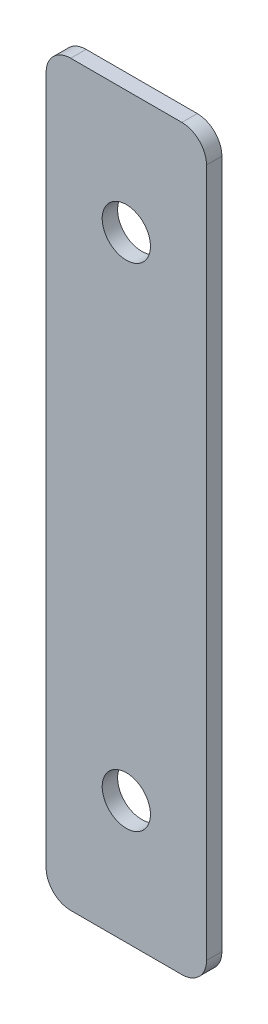
ISO-10303-21;
HEADER;
FILE_DESCRIPTION(('STEP AP214'),'2;1');
FILE_NAME('part.step','',(''),(''),'','','');
FILE_SCHEMA(('AUTOMOTIVE_DESIGN { 1 0 10303 214 1 1 1 1 }'));
ENDSEC;
DATA;
#1=APPLICATION_CONTEXT('core data for automotive mechanical design processes');
#2=APPLICATION_PROTOCOL_DEFINITION('international standard','automotive_design',2000,#1);
#3=PRODUCT_CONTEXT('',#1,'mechanical');
#4=PRODUCT('Part','Part','',(#3));
#5=PRODUCT_RELATED_PRODUCT_CATEGORY('part','',(#4));
#6=PRODUCT_DEFINITION_FORMATION('','',#4);
#7=PRODUCT_DEFINITION_CONTEXT('part definition',#1,'design');
#8=PRODUCT_DEFINITION('design','',#6,#7);
#9=PRODUCT_DEFINITION_SHAPE('','',#8);
#10=(LENGTH_UNIT() NAMED_UNIT(*) SI_UNIT(.MILLI.,.METRE.));
#11=(NAMED_UNIT(*) PLANE_ANGLE_UNIT() SI_UNIT($,.RADIAN.));
#12=(NAMED_UNIT(*) SI_UNIT($,.STERADIAN.) SOLID_ANGLE_UNIT());
#13=UNCERTAINTY_MEASURE_WITH_UNIT(LENGTH_MEASURE(1.E-05),#10,'distance_accuracy_value','');
#14=(GEOMETRIC_REPRESENTATION_CONTEXT(3) GLOBAL_UNCERTAINTY_ASSIGNED_CONTEXT((#13)) GLOBAL_UNIT_ASSIGNED_CONTEXT((#10,
#11,#12)) REPRESENTATION_CONTEXT('',''));
#15=CARTESIAN_POINT('',(0.,0.,0.));
#16=DIRECTION('',(0.,0.,1.));
#17=DIRECTION('',(1.,0.,0.));
#18=AXIS2_PLACEMENT_3D('',#15,#16,#17);
#19=CARTESIAN_POINT('',(-5.74039999999996,-53.975,1.5875));
#20=DIRECTION('',(0.,0.,1.));
#21=DIRECTION('',(1.,0.,0.));
#22=AXIS2_PLACEMENT_3D('',#19,#20,#21);
#23=PLANE('',#22);
#24=CARTESIAN_POINT('',(0.,-43.815,1.5875));
#25=DIRECTION('',(0.,0.,1.));
#26=DIRECTION('',(1.,0.,0.));
#27=AXIS2_PLACEMENT_3D('',#24,#25,#26);
#28=CIRCLE('',#27,2.4892);
#29=CARTESIAN_POINT('',(2.48920000000004,-43.815,1.5875));
#30=VERTEX_POINT('',#29);
#31=EDGE_CURVE('E140',#30,#30,#28,.T.);
#32=ORIENTED_EDGE('',*,*,#31,.F.);
#33=EDGE_LOOP('',(#32));
#34=FACE_BOUND('',#33,.T.);
#35=CARTESIAN_POINT('',(-5.74039999999996,-53.975,1.5875));
#36=DIRECTION('',(0.,0.,1.));
#37=DIRECTION('',(1.,0.,0.));
#38=AXIS2_PLACEMENT_3D('',#35,#36,#37);
#39=CIRCLE('',#38,2.54);
#40=CARTESIAN_POINT('',(-8.28039999999996,-53.975,1.5875));
#41=VERTEX_POINT('',#40);
#42=CARTESIAN_POINT('',(-5.74039999999996,-56.515,1.5875));
#43=VERTEX_POINT('',#42);
#44=EDGE_CURVE('E151',#41,#43,#39,.T.);
#45=ORIENTED_EDGE('',*,*,#44,.T.);
#46=DIRECTION('',(1.,0.,0.));
#47=VECTOR('',#46,1.);
#48=CARTESIAN_POINT('',(5.74039999999996,-56.515,1.5875));
#49=LINE('',#48,#47);
#50=CARTESIAN_POINT('',(5.74039999999997,-56.515,1.5875));
#51=VERTEX_POINT('',#50);
#52=EDGE_CURVE('E99',#43,#51,#49,.T.);
#53=ORIENTED_EDGE('',*,*,#52,.T.);
#54=CARTESIAN_POINT('',(5.74039999999996,-53.975,1.5875));
#55=DIRECTION('',(0.,0.,1.));
#56=DIRECTION('',(-1.,0.,0.));
#57=AXIS2_PLACEMENT_3D('',#54,#55,#56);
#58=CIRCLE('',#57,2.54);
#59=CARTESIAN_POINT('',(8.28039999999996,-53.975,1.5875));
#60=VERTEX_POINT('',#59);
#61=EDGE_CURVE('E166',#51,#60,#58,.T.);
#62=ORIENTED_EDGE('',*,*,#61,.T.);
#63=DIRECTION('',(0.,1.,0.));
#64=VECTOR('',#63,1.);
#65=CARTESIAN_POINT('',(8.28039999999996,-53.975,1.5875));
#66=LINE('',#65,#64);
#67=CARTESIAN_POINT('',(8.28039999999997,17.145,1.5875));
#68=VERTEX_POINT('',#67);
#69=EDGE_CURVE('E179',#60,#68,#66,.T.);
#70=ORIENTED_EDGE('',*,*,#69,.T.);
#71=CARTESIAN_POINT('',(5.74039999999996,17.145,1.5875));
#72=DIRECTION('',(0.,0.,1.));
#73=DIRECTION('',(-1.,0.,0.));
#74=AXIS2_PLACEMENT_3D('',#71,#72,#73);
#75=CIRCLE('',#74,2.54);
#76=CARTESIAN_POINT('',(5.74039999999996,19.685,1.5875));
#77=VERTEX_POINT('',#76);
#78=EDGE_CURVE('E118',#68,#77,#75,.T.);
#79=ORIENTED_EDGE('',*,*,#78,.T.);
#80=DIRECTION('',(-1.,0.,0.));
#81=VECTOR('',#80,1.);
#82=CARTESIAN_POINT('',(5.74039999999996,19.685,1.5875));
#83=LINE('',#82,#81);
#84=CARTESIAN_POINT('',(-5.74039999999996,19.685,1.5875));
#85=VERTEX_POINT('',#84);
#86=EDGE_CURVE('E112',#77,#85,#83,.T.);
#87=ORIENTED_EDGE('',*,*,#86,.T.);
#88=CARTESIAN_POINT('',(-5.74039999999996,17.145,1.5875));
#89=DIRECTION('',(0.,0.,1.));
#90=DIRECTION('',(1.,0.,0.));
#91=AXIS2_PLACEMENT_3D('',#88,#89,#90);
#92=CIRCLE('',#91,2.54);
#93=CARTESIAN_POINT('',(-8.28039999999996,17.145,1.5875));
#94=VERTEX_POINT('',#93);
#95=EDGE_CURVE('E116',#85,#94,#92,.T.);
#96=ORIENTED_EDGE('',*,*,#95,.T.);
#97=DIRECTION('',(0.,-1.,0.));
#98=VECTOR('',#97,1.);
#99=CARTESIAN_POINT('',(-8.28039999999996,-53.975,1.5875));
#100=LINE('',#99,#98);
#101=EDGE_CURVE('E56',#94,#41,#100,.T.);
#102=ORIENTED_EDGE('',*,*,#101,.T.);
#103=EDGE_LOOP('',(#45,#53,#62,#70,#79,#87,#96,#102));
#104=FACE_BOUND('',#103,.T.);
#105=CARTESIAN_POINT('',(0.,6.98499999999995,1.5875));
#106=DIRECTION('',(0.,0.,1.));
#107=DIRECTION('',(1.,0.,0.));
#108=AXIS2_PLACEMENT_3D('',#105,#106,#107);
#109=CIRCLE('',#108,2.4892);
#110=CARTESIAN_POINT('',(2.48920000000003,6.98499999999995,1.5875));
#111=VERTEX_POINT('',#110);
#112=EDGE_CURVE('E188',#111,#111,#109,.T.);
#113=ORIENTED_EDGE('',*,*,#112,.F.);
#114=EDGE_LOOP('',(#113));
#115=FACE_BOUND('',#114,.T.);
#116=ADVANCED_FACE('F39',(#34,#104,#115),#23,.T.);
#117=CARTESIAN_POINT('',(-5.74039999999996,-53.975,0.));
#118=DIRECTION('',(0.,0.,1.));
#119=DIRECTION('',(1.,0.,0.));
#120=AXIS2_PLACEMENT_3D('',#117,#118,#119);
#121=PLANE('',#120);
#122=CARTESIAN_POINT('',(-5.74039999999996,-53.975,0.));
#123=DIRECTION('',(0.,0.,1.));
#124=DIRECTION('',(1.,0.,0.));
#125=AXIS2_PLACEMENT_3D('',#122,#123,#124);
#126=CIRCLE('',#125,2.54);
#127=CARTESIAN_POINT('',(-8.28039999999996,-53.975,0.));
#128=VERTEX_POINT('',#127);
#129=CARTESIAN_POINT('',(-5.74039999999996,-56.515,0.));
#130=VERTEX_POINT('',#129);
#131=EDGE_CURVE('E136',#128,#130,#126,.T.);
#132=ORIENTED_EDGE('',*,*,#131,.F.);
#133=DIRECTION('',(0.,-1.,0.));
#134=VECTOR('',#133,1.);
#135=CARTESIAN_POINT('',(-8.28039999999996,-53.975,0.));
#136=LINE('',#135,#134);
#137=CARTESIAN_POINT('',(-8.28039999999996,17.145,0.));
#138=VERTEX_POINT('',#137);
#139=EDGE_CURVE('E91',#138,#128,#136,.T.);
#140=ORIENTED_EDGE('',*,*,#139,.F.);
#141=CARTESIAN_POINT('',(-5.74039999999996,17.145,0.));
#142=DIRECTION('',(0.,0.,1.));
#143=DIRECTION('',(1.,0.,0.));
#144=AXIS2_PLACEMENT_3D('',#141,#142,#143);
#145=CIRCLE('',#144,2.54);
#146=CARTESIAN_POINT('',(-5.74039999999996,19.685,0.));
#147=VERTEX_POINT('',#146);
#148=EDGE_CURVE('E85',#147,#138,#145,.T.);
#149=ORIENTED_EDGE('',*,*,#148,.F.);
#150=DIRECTION('',(-1.,0.,0.));
#151=VECTOR('',#150,1.);
#152=CARTESIAN_POINT('',(5.74039999999996,19.685,0.));
#153=LINE('',#152,#151);
#154=CARTESIAN_POINT('',(5.74039999999996,19.685,0.));
#155=VERTEX_POINT('',#154);
#156=EDGE_CURVE('E126',#155,#147,#153,.T.);
#157=ORIENTED_EDGE('',*,*,#156,.F.);
#158=CARTESIAN_POINT('',(5.74039999999996,17.145,0.));
#159=DIRECTION('',(0.,0.,1.));
#160=DIRECTION('',(-1.,0.,0.));
#161=AXIS2_PLACEMENT_3D('',#158,#159,#160);
#162=CIRCLE('',#161,2.54);
#163=CARTESIAN_POINT('',(8.28039999999997,17.145,0.));
#164=VERTEX_POINT('',#163);
#165=EDGE_CURVE('E146',#164,#155,#162,.T.);
#166=ORIENTED_EDGE('',*,*,#165,.F.);
#167=DIRECTION('',(0.,1.,0.));
#168=VECTOR('',#167,1.);
#169=CARTESIAN_POINT('',(8.28039999999996,-53.975,0.));
#170=LINE('',#169,#168);
#171=CARTESIAN_POINT('',(8.28039999999996,-53.975,0.));
#172=VERTEX_POINT('',#171);
#173=EDGE_CURVE('E144',#172,#164,#170,.T.);
#174=ORIENTED_EDGE('',*,*,#173,.F.);
#175=CARTESIAN_POINT('',(5.74039999999996,-53.975,0.));
#176=DIRECTION('',(0.,0.,1.));
#177=DIRECTION('',(-1.,0.,0.));
#178=AXIS2_PLACEMENT_3D('',#175,#176,#177);
#179=CIRCLE('',#178,2.54);
#180=CARTESIAN_POINT('',(5.74039999999997,-56.515,0.));
#181=VERTEX_POINT('',#180);
#182=EDGE_CURVE('E142',#181,#172,#179,.T.);
#183=ORIENTED_EDGE('',*,*,#182,.F.);
#184=DIRECTION('',(1.,0.,0.));
#185=VECTOR('',#184,1.);
#186=CARTESIAN_POINT('',(5.74039999999996,-56.515,0.));
#187=LINE('',#186,#185);
#188=EDGE_CURVE('E139',#130,#181,#187,.T.);
#189=ORIENTED_EDGE('',*,*,#188,.F.);
#190=EDGE_LOOP('',(#132,#140,#149,#157,#166,#174,#183,#189));
#191=FACE_BOUND('',#190,.T.);
#192=CARTESIAN_POINT('',(0.,-43.815,0.));
#193=DIRECTION('',(0.,0.,1.));
#194=DIRECTION('',(1.,0.,0.));
#195=AXIS2_PLACEMENT_3D('',#192,#193,#194);
#196=CIRCLE('',#195,2.4892);
#197=CARTESIAN_POINT('',(2.48920000000004,-43.815,0.));
#198=VERTEX_POINT('',#197);
#199=EDGE_CURVE('E185',#198,#198,#196,.T.);
#200=ORIENTED_EDGE('',*,*,#199,.T.);
#201=EDGE_LOOP('',(#200));
#202=FACE_BOUND('',#201,.T.);
#203=CARTESIAN_POINT('',(0.,6.98499999999995,0.));
#204=DIRECTION('',(0.,0.,1.));
#205=DIRECTION('',(1.,0.,0.));
#206=AXIS2_PLACEMENT_3D('',#203,#204,#205);
#207=CIRCLE('',#206,2.4892);
#208=CARTESIAN_POINT('',(2.48920000000003,6.98499999999995,0.));
#209=VERTEX_POINT('',#208);
#210=EDGE_CURVE('E191',#209,#209,#207,.T.);
#211=ORIENTED_EDGE('',*,*,#210,.T.);
#212=EDGE_LOOP('',(#211));
#213=FACE_BOUND('',#212,.T.);
#214=ADVANCED_FACE('F170',(#191,#202,#213),#121,.F.);
#215=CARTESIAN_POINT('',(-5.74039999999996,-53.975,1.5875));
#216=DIRECTION('',(0.,0.,-1.));
#217=DIRECTION('',(-1.,0.,0.));
#218=AXIS2_PLACEMENT_3D('',#215,#216,#217);
#219=CYLINDRICAL_SURFACE('',#218,2.54);
#220=ORIENTED_EDGE('',*,*,#131,.T.);
#221=DIRECTION('',(0.,0.,-1.));
#222=VECTOR('',#221,1.);
#223=CARTESIAN_POINT('',(-5.74039999999996,-56.515,1.5875));
#224=LINE('',#223,#222);
#225=EDGE_CURVE('E11',#43,#130,#224,.T.);
#226=ORIENTED_EDGE('',*,*,#225,.F.);
#227=ORIENTED_EDGE('',*,*,#44,.F.);
#228=DIRECTION('',(0.,0.,-1.));
#229=VECTOR('',#228,1.);
#230=CARTESIAN_POINT('',(-8.28039999999996,-53.975,1.5875));
#231=LINE('',#230,#229);
#232=EDGE_CURVE('E132',#41,#128,#231,.T.);
#233=ORIENTED_EDGE('',*,*,#232,.T.);
#234=EDGE_LOOP('',(#220,#226,#227,#233));
#235=FACE_BOUND('',#234,.T.);
#236=ADVANCED_FACE('F41',(#235),#219,.T.);
#237=CARTESIAN_POINT('',(5.74039999999996,-56.515,1.5875));
#238=DIRECTION('',(0.,1.,0.));
#239=DIRECTION('',(0.,0.,1.));
#240=AXIS2_PLACEMENT_3D('',#237,#238,#239);
#241=PLANE('',#240);
#242=ORIENTED_EDGE('',*,*,#188,.T.);
#243=DIRECTION('',(0.,0.,-1.));
#244=VECTOR('',#243,1.);
#245=CARTESIAN_POINT('',(5.74039999999997,-56.515,1.5875));
#246=LINE('',#245,#244);
#247=EDGE_CURVE('E48',#51,#181,#246,.T.);
#248=ORIENTED_EDGE('',*,*,#247,.F.);
#249=ORIENTED_EDGE('',*,*,#52,.F.);
#250=ORIENTED_EDGE('',*,*,#225,.T.);
#251=EDGE_LOOP('',(#242,#248,#249,#250));
#252=FACE_BOUND('',#251,.T.);
#253=ADVANCED_FACE('F223',(#252),#241,.F.);
#254=CARTESIAN_POINT('',(5.74039999999996,-53.975,1.5875));
#255=DIRECTION('',(0.,0.,-1.));
#256=DIRECTION('',(-1.,0.,0.));
#257=AXIS2_PLACEMENT_3D('',#254,#255,#256);
#258=CYLINDRICAL_SURFACE('',#257,2.54);
#259=ORIENTED_EDGE('',*,*,#182,.T.);
#260=DIRECTION('',(0.,0.,-1.));
#261=VECTOR('',#260,1.);
#262=CARTESIAN_POINT('',(8.28039999999996,-53.975,1.5875));
#263=LINE('',#262,#261);
#264=EDGE_CURVE('E158',#60,#172,#263,.T.);
#265=ORIENTED_EDGE('',*,*,#264,.F.);
#266=ORIENTED_EDGE('',*,*,#61,.F.);
#267=ORIENTED_EDGE('',*,*,#247,.T.);
#268=EDGE_LOOP('',(#259,#265,#266,#267));
#269=FACE_BOUND('',#268,.T.);
#270=ADVANCED_FACE('F164',(#269),#258,.T.);
#271=CARTESIAN_POINT('',(8.28039999999996,-53.975,1.5875));
#272=DIRECTION('',(-1.,0.,0.));
#273=DIRECTION('',(0.,0.,1.));
#274=AXIS2_PLACEMENT_3D('',#271,#272,#273);
#275=PLANE('',#274);
#276=ORIENTED_EDGE('',*,*,#173,.T.);
#277=DIRECTION('',(0.,0.,-1.));
#278=VECTOR('',#277,1.);
#279=CARTESIAN_POINT('',(8.28039999999997,17.145,1.5875));
#280=LINE('',#279,#278);
#281=EDGE_CURVE('E155',#68,#164,#280,.T.);
#282=ORIENTED_EDGE('',*,*,#281,.F.);
#283=ORIENTED_EDGE('',*,*,#69,.F.);
#284=ORIENTED_EDGE('',*,*,#264,.T.);
#285=EDGE_LOOP('',(#276,#282,#283,#284));
#286=FACE_BOUND('',#285,.T.);
#287=ADVANCED_FACE('F175',(#286),#275,.F.);
#288=CARTESIAN_POINT('',(5.74039999999996,17.145,1.5875));
#289=DIRECTION('',(0.,0.,-1.));
#290=DIRECTION('',(-1.,0.,0.));
#291=AXIS2_PLACEMENT_3D('',#288,#289,#290);
#292=CYLINDRICAL_SURFACE('',#291,2.54);
#293=ORIENTED_EDGE('',*,*,#165,.T.);
#294=DIRECTION('',(0.,0.,-1.));
#295=VECTOR('',#294,1.);
#296=CARTESIAN_POINT('',(5.74039999999996,19.685,1.5875));
#297=LINE('',#296,#295);
#298=EDGE_CURVE('E127',#77,#155,#297,.T.);
#299=ORIENTED_EDGE('',*,*,#298,.F.);
#300=ORIENTED_EDGE('',*,*,#78,.F.);
#301=ORIENTED_EDGE('',*,*,#281,.T.);
#302=EDGE_LOOP('',(#293,#299,#300,#301));
#303=FACE_BOUND('',#302,.T.);
#304=ADVANCED_FACE('F178',(#303),#292,.T.);
#305=CARTESIAN_POINT('',(5.74039999999996,19.685,1.5875));
#306=DIRECTION('',(0.,-1.,0.));
#307=DIRECTION('',(0.,0.,-1.));
#308=AXIS2_PLACEMENT_3D('',#305,#306,#307);
#309=PLANE('',#308);
#310=ORIENTED_EDGE('',*,*,#156,.T.);
#311=DIRECTION('',(0.,0.,-1.));
#312=VECTOR('',#311,1.);
#313=CARTESIAN_POINT('',(-5.74039999999996,19.685,1.5875));
#314=LINE('',#313,#312);
#315=EDGE_CURVE('E123',#85,#147,#314,.T.);
#316=ORIENTED_EDGE('',*,*,#315,.F.);
#317=ORIENTED_EDGE('',*,*,#86,.F.);
#318=ORIENTED_EDGE('',*,*,#298,.T.);
#319=EDGE_LOOP('',(#310,#316,#317,#318));
#320=FACE_BOUND('',#319,.T.);
#321=ADVANCED_FACE('F124',(#320),#309,.F.);
#322=CARTESIAN_POINT('',(-5.74039999999996,17.145,1.5875));
#323=DIRECTION('',(0.,0.,-1.));
#324=DIRECTION('',(-1.,0.,0.));
#325=AXIS2_PLACEMENT_3D('',#322,#323,#324);
#326=CYLINDRICAL_SURFACE('',#325,2.54);
#327=ORIENTED_EDGE('',*,*,#148,.T.);
#328=DIRECTION('',(0.,0.,-1.));
#329=VECTOR('',#328,1.);
#330=CARTESIAN_POINT('',(-8.28039999999996,17.145,1.5875));
#331=LINE('',#330,#329);
#332=EDGE_CURVE('E128',#94,#138,#331,.T.);
#333=ORIENTED_EDGE('',*,*,#332,.F.);
#334=ORIENTED_EDGE('',*,*,#95,.F.);
#335=ORIENTED_EDGE('',*,*,#315,.T.);
#336=EDGE_LOOP('',(#327,#333,#334,#335));
#337=FACE_BOUND('',#336,.T.);
#338=ADVANCED_FACE('F130',(#337),#326,.T.);
#339=CARTESIAN_POINT('',(-8.28039999999996,-53.975,1.5875));
#340=DIRECTION('',(1.,0.,0.));
#341=DIRECTION('',(0.,0.,-1.));
#342=AXIS2_PLACEMENT_3D('',#339,#340,#341);
#343=PLANE('',#342);
#344=ORIENTED_EDGE('',*,*,#139,.T.);
#345=ORIENTED_EDGE('',*,*,#232,.F.);
#346=ORIENTED_EDGE('',*,*,#101,.F.);
#347=ORIENTED_EDGE('',*,*,#332,.T.);
#348=EDGE_LOOP('',(#344,#345,#346,#347));
#349=FACE_BOUND('',#348,.T.);
#350=ADVANCED_FACE('F211',(#349),#343,.F.);
#351=CARTESIAN_POINT('',(0.,-43.815,1.5875));
#352=DIRECTION('',(0.,0.,-1.));
#353=DIRECTION('',(-1.,0.,0.));
#354=AXIS2_PLACEMENT_3D('',#351,#352,#353);
#355=CYLINDRICAL_SURFACE('',#354,2.4892);
#356=ORIENTED_EDGE('',*,*,#31,.T.);
#357=EDGE_LOOP('',(#356));
#358=FACE_BOUND('',#357,.T.);
#359=ORIENTED_EDGE('',*,*,#199,.F.);
#360=EDGE_LOOP('',(#359));
#361=FACE_BOUND('',#360,.T.);
#362=ADVANCED_FACE('F208',(#358,#361),#355,.F.);
#363=CARTESIAN_POINT('',(0.,6.98499999999995,1.5875));
#364=DIRECTION('',(0.,0.,-1.));
#365=DIRECTION('',(-1.,0.,0.));
#366=AXIS2_PLACEMENT_3D('',#363,#364,#365);
#367=CYLINDRICAL_SURFACE('',#366,2.4892);
#368=ORIENTED_EDGE('',*,*,#112,.T.);
#369=EDGE_LOOP('',(#368));
#370=FACE_BOUND('',#369,.T.);
#371=ORIENTED_EDGE('',*,*,#210,.F.);
#372=EDGE_LOOP('',(#371));
#373=FACE_BOUND('',#372,.T.);
#374=ADVANCED_FACE('F197',(#370,#373),#367,.F.);
#375=CLOSED_SHELL('',(#116,#214,#236,#253,#270,#287,#304,#321,#338,#350,#362,#374));
#376=MANIFOLD_SOLID_BREP('B2',#375);
#377=ADVANCED_BREP_SHAPE_REPRESENTATION('',(#18,#376),#14);
#378=SHAPE_DEFINITION_REPRESENTATION(#9,#377);
ENDSEC;
END-ISO-10303-21;
